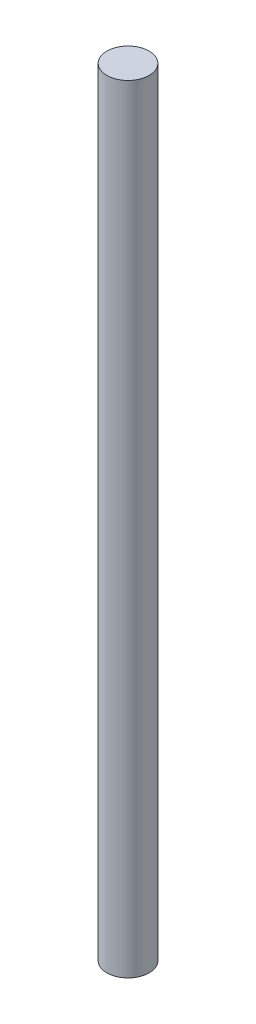
ISO-10303-21;
HEADER;
FILE_DESCRIPTION(('STEP AP214'),'2;1');
FILE_NAME('part.step','',(''),(''),'','','');
FILE_SCHEMA(('AUTOMOTIVE_DESIGN { 1 0 10303 214 1 1 1 1 }'));
ENDSEC;
DATA;
#1=APPLICATION_CONTEXT('core data for automotive mechanical design processes');
#2=APPLICATION_PROTOCOL_DEFINITION('international standard','automotive_design',2000,#1);
#3=PRODUCT_CONTEXT('',#1,'mechanical');
#4=PRODUCT('Part','Part','',(#3));
#5=PRODUCT_RELATED_PRODUCT_CATEGORY('part','',(#4));
#6=PRODUCT_DEFINITION_FORMATION('','',#4);
#7=PRODUCT_DEFINITION_CONTEXT('part definition',#1,'design');
#8=PRODUCT_DEFINITION('design','',#6,#7);
#9=PRODUCT_DEFINITION_SHAPE('','',#8);
#10=(LENGTH_UNIT() NAMED_UNIT(*) SI_UNIT(.MILLI.,.METRE.));
#11=(NAMED_UNIT(*) PLANE_ANGLE_UNIT() SI_UNIT($,.RADIAN.));
#12=(NAMED_UNIT(*) SI_UNIT($,.STERADIAN.) SOLID_ANGLE_UNIT());
#13=UNCERTAINTY_MEASURE_WITH_UNIT(LENGTH_MEASURE(1.E-05),#10,'distance_accuracy_value','');
#14=(GEOMETRIC_REPRESENTATION_CONTEXT(3) GLOBAL_UNCERTAINTY_ASSIGNED_CONTEXT((#13)) GLOBAL_UNIT_ASSIGNED_CONTEXT((#10,
#11,#12)) REPRESENTATION_CONTEXT('',''));
#15=CARTESIAN_POINT('',(0.,0.,0.));
#16=DIRECTION('',(0.,0.,1.));
#17=DIRECTION('',(1.,0.,0.));
#18=AXIS2_PLACEMENT_3D('',#15,#16,#17);
#19=CARTESIAN_POINT('',(0.,460.,0.));
#20=DIRECTION('',(0.,-1.,0.));
#21=DIRECTION('',(0.,0.,-1.));
#22=AXIS2_PLACEMENT_3D('',#19,#20,#21);
#23=CYLINDRICAL_SURFACE('',#22,12.5);
#24=CARTESIAN_POINT('',(0.,460.,0.));
#25=DIRECTION('',(0.,1.,0.));
#26=DIRECTION('',(0.,0.,1.));
#27=AXIS2_PLACEMENT_3D('',#24,#25,#26);
#28=CIRCLE('',#27,12.5);
#29=CARTESIAN_POINT('',(0.,460.,-12.5));
#30=VERTEX_POINT('',#29);
#31=EDGE_CURVE('E10',#30,#30,#28,.T.);
#32=CARTESIAN_POINT('',(0.,0.,0.));
#33=DIRECTION('',(0.,1.,0.));
#34=DIRECTION('',(0.,0.,1.));
#35=AXIS2_PLACEMENT_3D('',#32,#33,#34);
#36=CIRCLE('',#35,12.5);
#37=CARTESIAN_POINT('',(0.,0.,-12.5));
#38=VERTEX_POINT('',#37);
#39=EDGE_CURVE('E34',#38,#38,#36,.T.);
#40=CARTESIAN_POINT('',(0.,460.,-12.5));
#41=CARTESIAN_POINT('',(0.,455.208333333333,-12.5));
#42=CARTESIAN_POINT('',(0.,450.416666666667,-12.5));
#43=CARTESIAN_POINT('',(0.,440.833333333333,-12.5));
#44=CARTESIAN_POINT('',(0.,436.041666666667,-12.5));
#45=CARTESIAN_POINT('',(0.,426.458333333333,-12.5));
#46=CARTESIAN_POINT('',(0.,421.666666666667,-12.5));
#47=CARTESIAN_POINT('',(0.,412.083333333333,-12.5));
#48=CARTESIAN_POINT('',(0.,407.291666666667,-12.5));
#49=CARTESIAN_POINT('',(0.,397.708333333333,-12.5));
#50=CARTESIAN_POINT('',(0.,392.916666666667,-12.5));
#51=CARTESIAN_POINT('',(0.,383.333333333333,-12.5));
#52=CARTESIAN_POINT('',(0.,378.541666666667,-12.5));
#53=CARTESIAN_POINT('',(0.,368.958333333333,-12.5));
#54=CARTESIAN_POINT('',(0.,364.166666666667,-12.5));
#55=CARTESIAN_POINT('',(0.,354.583333333333,-12.5));
#56=CARTESIAN_POINT('',(0.,349.791666666667,-12.5));
#57=CARTESIAN_POINT('',(0.,340.208333333333,-12.5));
#58=CARTESIAN_POINT('',(0.,335.416666666667,-12.5));
#59=CARTESIAN_POINT('',(0.,325.833333333333,-12.5));
#60=CARTESIAN_POINT('',(0.,321.041666666667,-12.5));
#61=CARTESIAN_POINT('',(0.,311.458333333333,-12.5));
#62=CARTESIAN_POINT('',(0.,306.666666666667,-12.5));
#63=CARTESIAN_POINT('',(0.,297.083333333333,-12.5));
#64=CARTESIAN_POINT('',(0.,292.291666666667,-12.5));
#65=CARTESIAN_POINT('',(0.,282.708333333333,-12.5));
#66=CARTESIAN_POINT('',(0.,277.916666666667,-12.5));
#67=CARTESIAN_POINT('',(0.,268.333333333333,-12.5));
#68=CARTESIAN_POINT('',(0.,263.541666666667,-12.5));
#69=CARTESIAN_POINT('',(0.,253.958333333333,-12.5));
#70=CARTESIAN_POINT('',(0.,249.166666666667,-12.5));
#71=CARTESIAN_POINT('',(0.,239.583333333333,-12.5));
#72=CARTESIAN_POINT('',(0.,234.791666666667,-12.5));
#73=CARTESIAN_POINT('',(0.,225.208333333333,-12.5));
#74=CARTESIAN_POINT('',(0.,220.416666666667,-12.5));
#75=CARTESIAN_POINT('',(0.,210.833333333333,-12.5));
#76=CARTESIAN_POINT('',(0.,206.041666666667,-12.5));
#77=CARTESIAN_POINT('',(0.,196.458333333333,-12.5));
#78=CARTESIAN_POINT('',(0.,191.666666666667,-12.5));
#79=CARTESIAN_POINT('',(0.,182.083333333333,-12.5));
#80=CARTESIAN_POINT('',(0.,177.291666666667,-12.5));
#81=CARTESIAN_POINT('',(0.,167.708333333333,-12.5));
#82=CARTESIAN_POINT('',(0.,162.916666666667,-12.5));
#83=CARTESIAN_POINT('',(0.,153.333333333333,-12.5));
#84=CARTESIAN_POINT('',(0.,148.541666666667,-12.5));
#85=CARTESIAN_POINT('',(0.,138.958333333333,-12.5));
#86=CARTESIAN_POINT('',(0.,134.166666666667,-12.5));
#87=CARTESIAN_POINT('',(0.,124.583333333333,-12.5));
#88=CARTESIAN_POINT('',(0.,119.791666666667,-12.5));
#89=CARTESIAN_POINT('',(0.,110.208333333333,-12.5));
#90=CARTESIAN_POINT('',(0.,105.416666666667,-12.5));
#91=CARTESIAN_POINT('',(0.,95.8333333333333,-12.5));
#92=CARTESIAN_POINT('',(0.,91.0416666666667,-12.5));
#93=CARTESIAN_POINT('',(0.,81.4583333333333,-12.5));
#94=CARTESIAN_POINT('',(0.,76.6666666666666,-12.5));
#95=CARTESIAN_POINT('',(0.,67.0833333333333,-12.5));
#96=CARTESIAN_POINT('',(0.,62.2916666666667,-12.5));
#97=CARTESIAN_POINT('',(0.,52.7083333333333,-12.5));
#98=CARTESIAN_POINT('',(0.,47.9166666666667,-12.5));
#99=CARTESIAN_POINT('',(0.,38.3333333333333,-12.5));
#100=CARTESIAN_POINT('',(0.,33.5416666666666,-12.5));
#101=CARTESIAN_POINT('',(0.,23.9583333333333,-12.5));
#102=CARTESIAN_POINT('',(0.,19.1666666666666,-12.5));
#103=CARTESIAN_POINT('',(0.,9.58333333333329,-12.5));
#104=CARTESIAN_POINT('',(0.,4.79166666666662,-12.5));
#105=CARTESIAN_POINT('',(0.,0.,-12.5));
#106=B_SPLINE_CURVE_WITH_KNOTS('',3,(#40,#41,#42,#43,#44,#45,#46,#47,#48,#49,#50,#51,#52,#53,
#54,#55,#56,#57,#58,#59,#60,#61,#62,#63,#64,#65,#66,#67,#68,#69,#70,#71,#72,#73,#74,#75,#76,#77,
#78,#79,#80,#81,#82,#83,#84,#85,#86,#87,#88,#89,#90,#91,#92,#93,#94,#95,#96,#97,#98,#99,#100,
#101,#102,#103,#104,#105),.UNSPECIFIED.,.F.,.F.,(4,2,2,2,2,2,2,2,2,2,2,2,2,2,2,2,2,2,2,2,2,2,2,
2,2,2,2,2,2,2,2,2,4),(0.,14.375,28.75,43.125,57.5,71.875,86.25,100.625,115.,129.375,143.75,
158.125,172.5,186.875,201.25,215.625,230.,244.375,258.75,273.125,287.5,301.875,316.25,330.625,
345.,359.375,373.75,388.125,402.5,416.875,431.25,445.625,460.),.UNSPECIFIED.);
#107=EDGE_CURVE('BSEAM31',#30,#38,#106,.T.);
#108=ORIENTED_EDGE('',*,*,#31,.F.);
#109=ORIENTED_EDGE('',*,*,#39,.T.);
#110=ORIENTED_EDGE('',*,*,#107,.T.);
#111=ORIENTED_EDGE('',*,*,#107,.F.);
#112=EDGE_LOOP('',(#108,#110,#109,#111));
#113=FACE_BOUND('',#112,.T.);
#114=ADVANCED_FACE('F31',(#113),#23,.T.);
#115=CARTESIAN_POINT('',(0.,460.,0.));
#116=DIRECTION('',(0.,1.,0.));
#117=DIRECTION('',(0.,0.,1.));
#118=AXIS2_PLACEMENT_3D('',#115,#116,#117);
#119=PLANE('',#118);
#120=ORIENTED_EDGE('',*,*,#31,.T.);
#121=EDGE_LOOP('',(#120));
#122=FACE_BOUND('',#121,.T.);
#123=ADVANCED_FACE('F46',(#122),#119,.T.);
#124=CARTESIAN_POINT('',(0.,0.,0.));
#125=DIRECTION('',(0.,1.,0.));
#126=DIRECTION('',(0.,0.,1.));
#127=AXIS2_PLACEMENT_3D('',#124,#125,#126);
#128=PLANE('',#127);
#129=ORIENTED_EDGE('',*,*,#39,.F.);
#130=EDGE_LOOP('',(#129));
#131=FACE_BOUND('',#130,.T.);
#132=ADVANCED_FACE('F44',(#131),#128,.F.);
#133=CLOSED_SHELL('',(#114,#123,#132));
#134=MANIFOLD_SOLID_BREP('B2',#133);
#135=ADVANCED_BREP_SHAPE_REPRESENTATION('',(#18,#134),#14);
#136=SHAPE_DEFINITION_REPRESENTATION(#9,#135);
ENDSEC;
END-ISO-10303-21;
